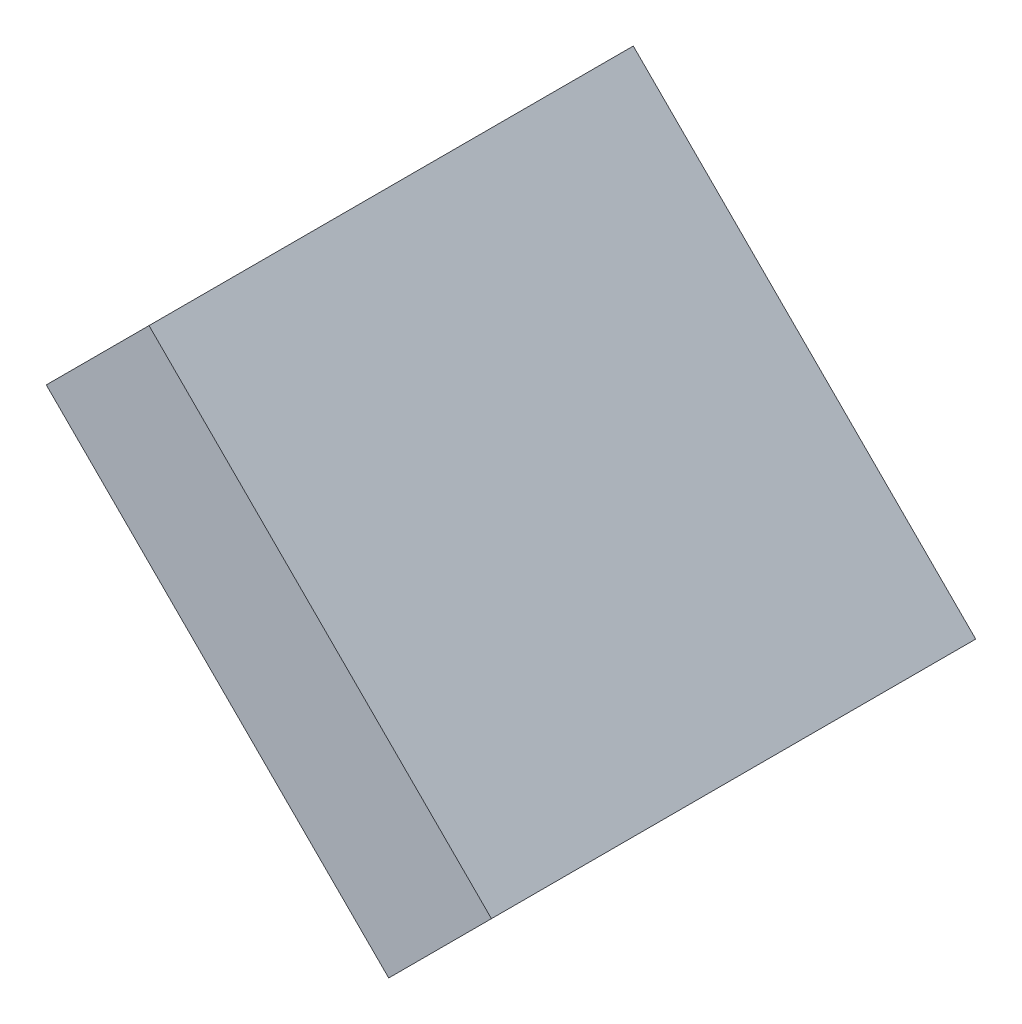
ISO-10303-21;
HEADER;
FILE_DESCRIPTION(('STEP AP214'),'2;1');
FILE_NAME('part.step','',(''),(''),'','','');
FILE_SCHEMA(('AUTOMOTIVE_DESIGN { 1 0 10303 214 1 1 1 1 }'));
ENDSEC;
DATA;
#1=APPLICATION_CONTEXT('core data for automotive mechanical design processes');
#2=APPLICATION_PROTOCOL_DEFINITION('international standard','automotive_design',2000,#1);
#3=PRODUCT_CONTEXT('',#1,'mechanical');
#4=PRODUCT('Part','Part','',(#3));
#5=PRODUCT_RELATED_PRODUCT_CATEGORY('part','',(#4));
#6=PRODUCT_DEFINITION_FORMATION('','',#4);
#7=PRODUCT_DEFINITION_CONTEXT('part definition',#1,'design');
#8=PRODUCT_DEFINITION('design','',#6,#7);
#9=PRODUCT_DEFINITION_SHAPE('','',#8);
#10=(LENGTH_UNIT() NAMED_UNIT(*) SI_UNIT(.MILLI.,.METRE.));
#11=(NAMED_UNIT(*) PLANE_ANGLE_UNIT() SI_UNIT($,.RADIAN.));
#12=(NAMED_UNIT(*) SI_UNIT($,.STERADIAN.) SOLID_ANGLE_UNIT());
#13=UNCERTAINTY_MEASURE_WITH_UNIT(LENGTH_MEASURE(1.E-05),#10,'distance_accuracy_value','');
#14=(GEOMETRIC_REPRESENTATION_CONTEXT(3) GLOBAL_UNCERTAINTY_ASSIGNED_CONTEXT((#13)) GLOBAL_UNIT_ASSIGNED_CONTEXT((#10,
#11,#12)) REPRESENTATION_CONTEXT('',''));
#15=CARTESIAN_POINT('',(0.,0.,0.));
#16=DIRECTION('',(0.,0.,1.));
#17=DIRECTION('',(1.,0.,0.));
#18=AXIS2_PLACEMENT_3D('',#15,#16,#17);
#19=CARTESIAN_POINT('',(101.10612702975,24.563713600431,0.));
#20=DIRECTION('',(-0.707106781186548,-0.707106781186548,0.));
#21=DIRECTION('',(-0.707106781186548,0.707106781186548,0.));
#22=AXIS2_PLACEMENT_3D('',#19,#20,#21);
#23=PLANE('',#22);
#24=DIRECTION('',(0.,0.,1.));
#25=VECTOR('',#24,1.);
#26=CARTESIAN_POINT('',(101.10612702975,24.563713600431,0.));
#27=LINE('',#26,#25);
#28=CARTESIAN_POINT('',(101.10612702975,24.563713600431,0.45));
#29=VERTEX_POINT('',#28);
#30=CARTESIAN_POINT('',(101.10612702975,24.563713600431,0.5));
#31=VERTEX_POINT('',#30);
#32=EDGE_CURVE('E154',#29,#31,#27,.T.);
#33=ORIENTED_EDGE('',*,*,#32,.F.);
#34=DIRECTION('',(-0.707106781186548,0.707106781186548,0.));
#35=VECTOR('',#34,1.);
#36=CARTESIAN_POINT('',(101.10612702975,24.563713600431,0.45));
#37=LINE('',#36,#35);
#38=CARTESIAN_POINT('',(101.45968042035,24.210160209837,0.45));
#39=VERTEX_POINT('',#38);
#40=EDGE_CURVE('E11',#39,#29,#37,.T.);
#41=ORIENTED_EDGE('',*,*,#40,.F.);
#42=DIRECTION('',(0.,0.,1.));
#43=VECTOR('',#42,1.);
#44=CARTESIAN_POINT('',(101.45968042035,24.210160209837,0.));
#45=LINE('',#44,#43);
#46=CARTESIAN_POINT('',(101.45968042035,24.210160209837,0.5));
#47=VERTEX_POINT('',#46);
#48=EDGE_CURVE('E165',#39,#47,#45,.T.);
#49=ORIENTED_EDGE('',*,*,#48,.T.);
#50=DIRECTION('',(0.707106781186548,-0.707106781186548,0.));
#51=VECTOR('',#50,1.);
#52=CARTESIAN_POINT('',(101.10612702975,24.563713600431,0.5));
#53=LINE('',#52,#51);
#54=EDGE_CURVE('E70',#31,#47,#53,.T.);
#55=ORIENTED_EDGE('',*,*,#54,.F.);
#56=EDGE_LOOP('',(#33,#41,#49,#55));
#57=FACE_BOUND('',#56,.T.);
#58=ADVANCED_FACE('F16',(#57),#23,.T.);
#59=CARTESIAN_POINT('',(101.17683770787,24.634424278549,0.45));
#60=DIRECTION('',(0.,0.,1.));
#61=DIRECTION('',(1.,0.,0.));
#62=AXIS2_PLACEMENT_3D('',#59,#60,#61);
#63=PLANE('',#62);
#64=ORIENTED_EDGE('',*,*,#40,.T.);
#65=DIRECTION('',(-0.707106781186548,-0.707106781186548,0.));
#66=VECTOR('',#65,1.);
#67=CARTESIAN_POINT('',(101.17683770787,24.634424278549,0.45));
#68=LINE('',#67,#66);
#69=CARTESIAN_POINT('',(101.17683770787,24.634424278549,0.45));
#70=VERTEX_POINT('',#69);
#71=EDGE_CURVE('E152',#70,#29,#68,.T.);
#72=ORIENTED_EDGE('',*,*,#71,.F.);
#73=DIRECTION('',(0.707106781186548,-0.707106781186548,0.));
#74=VECTOR('',#73,1.);
#75=CARTESIAN_POINT('',(101.17683770787,24.634424278549,0.45));
#76=LINE('',#75,#74);
#77=CARTESIAN_POINT('',(101.53039109847,24.280870887956,0.45));
#78=VERTEX_POINT('',#77);
#79=EDGE_CURVE('E26',#70,#78,#76,.T.);
#80=ORIENTED_EDGE('',*,*,#79,.T.);
#81=DIRECTION('',(-0.707106781186548,-0.707106781186548,0.));
#82=VECTOR('',#81,1.);
#83=CARTESIAN_POINT('',(101.53039109847,24.280870887956,0.45));
#84=LINE('',#83,#82);
#85=EDGE_CURVE('E188',#78,#39,#84,.T.);
#86=ORIENTED_EDGE('',*,*,#85,.T.);
#87=EDGE_LOOP('',(#64,#72,#80,#86));
#88=FACE_BOUND('',#87,.T.);
#89=ADVANCED_FACE('F189',(#88),#63,.F.);
#90=CARTESIAN_POINT('',(101.17683770787,24.634424278549,0.05));
#91=DIRECTION('',(-0.707106781186548,-0.707106781186548,0.));
#92=DIRECTION('',(-0.707106781186548,0.707106781186548,0.));
#93=AXIS2_PLACEMENT_3D('',#90,#91,#92);
#94=PLANE('',#93);
#95=DIRECTION('',(0.,0.,1.));
#96=VECTOR('',#95,1.);
#97=CARTESIAN_POINT('',(101.17683770787,24.634424278549,0.05));
#98=LINE('',#97,#96);
#99=CARTESIAN_POINT('',(101.17683770787,24.634424278549,0.05));
#100=VERTEX_POINT('',#99);
#101=EDGE_CURVE('E148',#100,#70,#98,.T.);
#102=ORIENTED_EDGE('',*,*,#101,.F.);
#103=DIRECTION('',(0.707106781186548,-0.707106781186548,0.));
#104=VECTOR('',#103,1.);
#105=CARTESIAN_POINT('',(101.17683770787,24.634424278549,0.05));
#106=LINE('',#105,#104);
#107=CARTESIAN_POINT('',(101.53039109847,24.280870887956,0.05));
#108=VERTEX_POINT('',#107);
#109=EDGE_CURVE('E40',#100,#108,#106,.T.);
#110=ORIENTED_EDGE('',*,*,#109,.T.);
#111=DIRECTION('',(0.,0.,1.));
#112=VECTOR('',#111,1.);
#113=CARTESIAN_POINT('',(101.53039109847,24.280870887956,0.05));
#114=LINE('',#113,#112);
#115=EDGE_CURVE('E192',#108,#78,#114,.T.);
#116=ORIENTED_EDGE('',*,*,#115,.T.);
#117=ORIENTED_EDGE('',*,*,#79,.F.);
#118=EDGE_LOOP('',(#102,#110,#116,#117));
#119=FACE_BOUND('',#118,.T.);
#120=ADVANCED_FACE('F314',(#119),#94,.T.);
#121=CARTESIAN_POINT('',(101.17683770787,24.634424278549,0.05));
#122=DIRECTION('',(0.,0.,1.));
#123=DIRECTION('',(1.,0.,0.));
#124=AXIS2_PLACEMENT_3D('',#121,#122,#123);
#125=PLANE('',#124);
#126=DIRECTION('',(-0.707106781186548,-0.707106781186548,0.));
#127=VECTOR('',#126,1.);
#128=CARTESIAN_POINT('',(101.53039109847,24.280870887956,0.05));
#129=LINE('',#128,#127);
#130=CARTESIAN_POINT('',(101.45968042035,24.210160209837,0.05));
#131=VERTEX_POINT('',#130);
#132=EDGE_CURVE('E19',#108,#131,#129,.T.);
#133=ORIENTED_EDGE('',*,*,#132,.F.);
#134=ORIENTED_EDGE('',*,*,#109,.F.);
#135=DIRECTION('',(-0.707106781186548,-0.707106781186548,0.));
#136=VECTOR('',#135,1.);
#137=CARTESIAN_POINT('',(101.17683770787,24.634424278549,0.05));
#138=LINE('',#137,#136);
#139=CARTESIAN_POINT('',(101.10612702975,24.563713600431,0.05));
#140=VERTEX_POINT('',#139);
#141=EDGE_CURVE('E153',#100,#140,#138,.T.);
#142=ORIENTED_EDGE('',*,*,#141,.T.);
#143=DIRECTION('',(-0.707106781186548,0.707106781186548,0.));
#144=VECTOR('',#143,1.);
#145=CARTESIAN_POINT('',(101.10612702975,24.563713600431,0.05));
#146=LINE('',#145,#144);
#147=EDGE_CURVE('E143',#131,#140,#146,.T.);
#148=ORIENTED_EDGE('',*,*,#147,.F.);
#149=EDGE_LOOP('',(#133,#134,#142,#148));
#150=FACE_BOUND('',#149,.T.);
#151=ADVANCED_FACE('F318',(#150),#125,.T.);
#152=CARTESIAN_POINT('',(101.10612702975,24.563713600431,0.));
#153=DIRECTION('',(-0.707106781186548,-0.707106781186548,0.));
#154=DIRECTION('',(-0.707106781186548,0.707106781186548,0.));
#155=AXIS2_PLACEMENT_3D('',#152,#153,#154);
#156=PLANE('',#155);
#157=DIRECTION('',(0.,0.,1.));
#158=VECTOR('',#157,1.);
#159=CARTESIAN_POINT('',(101.10612702975,24.563713600431,0.));
#160=LINE('',#159,#158);
#161=CARTESIAN_POINT('',(101.10612702975,24.563713600431,0.));
#162=VERTEX_POINT('',#161);
#163=EDGE_CURVE('E141',#162,#140,#160,.T.);
#164=ORIENTED_EDGE('',*,*,#163,.F.);
#165=DIRECTION('',(0.707106781186548,-0.707106781186548,0.));
#166=VECTOR('',#165,1.);
#167=CARTESIAN_POINT('',(101.10612702975,24.563713600431,0.));
#168=LINE('',#167,#166);
#169=CARTESIAN_POINT('',(101.45968042035,24.210160209837,0.));
#170=VERTEX_POINT('',#169);
#171=EDGE_CURVE('E147',#162,#170,#168,.T.);
#172=ORIENTED_EDGE('',*,*,#171,.T.);
#173=DIRECTION('',(0.,0.,1.));
#174=VECTOR('',#173,1.);
#175=CARTESIAN_POINT('',(101.45968042035,24.210160209837,0.));
#176=LINE('',#175,#174);
#177=EDGE_CURVE('E119',#170,#131,#176,.T.);
#178=ORIENTED_EDGE('',*,*,#177,.T.);
#179=ORIENTED_EDGE('',*,*,#147,.T.);
#180=EDGE_LOOP('',(#164,#172,#178,#179));
#181=FACE_BOUND('',#180,.T.);
#182=ADVANCED_FACE('F326',(#181),#156,.T.);
#183=CARTESIAN_POINT('',(101.21219304693,24.669779617609,0.));
#184=DIRECTION('',(0.,0.,1.));
#185=DIRECTION('',(1.,0.,0.));
#186=AXIS2_PLACEMENT_3D('',#183,#184,#185);
#187=PLANE('',#186);
#188=DIRECTION('',(-0.707106781186548,-0.707106781186548,0.));
#189=VECTOR('',#188,1.);
#190=CARTESIAN_POINT('',(101.56574643753,24.316226227015,0.));
#191=LINE('',#190,#189);
#192=CARTESIAN_POINT('',(101.56574643753,24.316226227015,0.));
#193=VERTEX_POINT('',#192);
#194=EDGE_CURVE('E105',#193,#170,#191,.T.);
#195=ORIENTED_EDGE('',*,*,#194,.T.);
#196=ORIENTED_EDGE('',*,*,#171,.F.);
#197=DIRECTION('',(-0.707106781186548,-0.707106781186548,0.));
#198=VECTOR('',#197,1.);
#199=CARTESIAN_POINT('',(101.21219304693,24.669779617609,0.));
#200=LINE('',#199,#198);
#201=CARTESIAN_POINT('',(101.21219304693,24.669779617609,0.));
#202=VERTEX_POINT('',#201);
#203=EDGE_CURVE('E162',#202,#162,#200,.T.);
#204=ORIENTED_EDGE('',*,*,#203,.F.);
#205=DIRECTION('',(0.707106781186548,-0.707106781186548,0.));
#206=VECTOR('',#205,1.);
#207=CARTESIAN_POINT('',(101.21219304693,24.669779617609,0.));
#208=LINE('',#207,#206);
#209=EDGE_CURVE('E127',#202,#193,#208,.T.);
#210=ORIENTED_EDGE('',*,*,#209,.T.);
#211=EDGE_LOOP('',(#195,#196,#204,#210));
#212=FACE_BOUND('',#211,.T.);
#213=ADVANCED_FACE('F181',(#212),#187,.F.);
#214=CARTESIAN_POINT('',(101.56574643753,24.316226227015,0.));
#215=DIRECTION('',(0.707106781186548,-0.707106781186548,0.));
#216=DIRECTION('',(0.,0.,-1.));
#217=AXIS2_PLACEMENT_3D('',#214,#215,#216);
#218=PLANE('',#217);
#219=ORIENTED_EDGE('',*,*,#177,.F.);
#220=ORIENTED_EDGE('',*,*,#194,.F.);
#221=DIRECTION('',(0.,0.,1.));
#222=VECTOR('',#221,1.);
#223=CARTESIAN_POINT('',(101.56574643753,24.316226227015,0.));
#224=LINE('',#223,#222);
#225=CARTESIAN_POINT('',(101.56574643753,24.316226227015,0.5));
#226=VERTEX_POINT('',#225);
#227=EDGE_CURVE('E122',#193,#226,#224,.T.);
#228=ORIENTED_EDGE('',*,*,#227,.T.);
#229=DIRECTION('',(-0.707106781186548,-0.707106781186548,0.));
#230=VECTOR('',#229,1.);
#231=CARTESIAN_POINT('',(101.56574643753,24.316226227015,0.5));
#232=LINE('',#231,#230);
#233=EDGE_CURVE('E113',#226,#47,#232,.T.);
#234=ORIENTED_EDGE('',*,*,#233,.T.);
#235=ORIENTED_EDGE('',*,*,#48,.F.);
#236=ORIENTED_EDGE('',*,*,#85,.F.);
#237=ORIENTED_EDGE('',*,*,#115,.F.);
#238=ORIENTED_EDGE('',*,*,#132,.T.);
#239=EDGE_LOOP('',(#219,#220,#228,#234,#235,#236,#237,#238));
#240=FACE_BOUND('',#239,.T.);
#241=ADVANCED_FACE('F123',(#240),#218,.T.);
#242=CARTESIAN_POINT('',(101.21219304693,24.669779617609,0.5));
#243=DIRECTION('',(0.,0.,1.));
#244=DIRECTION('',(1.,0.,0.));
#245=AXIS2_PLACEMENT_3D('',#242,#243,#244);
#246=PLANE('',#245);
#247=DIRECTION('',(0.707106781186548,-0.707106781186548,0.));
#248=VECTOR('',#247,1.);
#249=CARTESIAN_POINT('',(101.21219304693,24.669779617609,0.5));
#250=LINE('',#249,#248);
#251=CARTESIAN_POINT('',(101.21219304693,24.669779617609,0.5));
#252=VERTEX_POINT('',#251);
#253=EDGE_CURVE('E116',#252,#226,#250,.T.);
#254=ORIENTED_EDGE('',*,*,#253,.F.);
#255=DIRECTION('',(-0.707106781186548,-0.707106781186548,0.));
#256=VECTOR('',#255,1.);
#257=CARTESIAN_POINT('',(101.21219304693,24.669779617609,0.5));
#258=LINE('',#257,#256);
#259=EDGE_CURVE('E158',#252,#31,#258,.T.);
#260=ORIENTED_EDGE('',*,*,#259,.T.);
#261=ORIENTED_EDGE('',*,*,#54,.T.);
#262=ORIENTED_EDGE('',*,*,#233,.F.);
#263=EDGE_LOOP('',(#254,#260,#261,#262));
#264=FACE_BOUND('',#263,.T.);
#265=ADVANCED_FACE('F114',(#264),#246,.T.);
#266=CARTESIAN_POINT('',(101.21219304693,24.669779617609,0.));
#267=DIRECTION('',(0.707106781186548,-0.707106781186548,0.));
#268=DIRECTION('',(0.,0.,-1.));
#269=AXIS2_PLACEMENT_3D('',#266,#267,#268);
#270=PLANE('',#269);
#271=ORIENTED_EDGE('',*,*,#141,.F.);
#272=ORIENTED_EDGE('',*,*,#101,.T.);
#273=ORIENTED_EDGE('',*,*,#71,.T.);
#274=ORIENTED_EDGE('',*,*,#32,.T.);
#275=ORIENTED_EDGE('',*,*,#259,.F.);
#276=DIRECTION('',(0.,0.,1.));
#277=VECTOR('',#276,1.);
#278=CARTESIAN_POINT('',(101.21219304693,24.669779617609,0.));
#279=LINE('',#278,#277);
#280=EDGE_CURVE('E132',#202,#252,#279,.T.);
#281=ORIENTED_EDGE('',*,*,#280,.F.);
#282=ORIENTED_EDGE('',*,*,#203,.T.);
#283=ORIENTED_EDGE('',*,*,#163,.T.);
#284=EDGE_LOOP('',(#271,#272,#273,#274,#275,#281,#282,#283));
#285=FACE_BOUND('',#284,.T.);
#286=ADVANCED_FACE('F185',(#285),#270,.F.);
#287=CARTESIAN_POINT('',(101.21219304693,24.669779617609,0.));
#288=DIRECTION('',(-0.707106781186548,-0.707106781186548,0.));
#289=DIRECTION('',(-0.707106781186548,0.707106781186548,0.));
#290=AXIS2_PLACEMENT_3D('',#287,#288,#289);
#291=PLANE('',#290);
#292=ORIENTED_EDGE('',*,*,#253,.T.);
#293=ORIENTED_EDGE('',*,*,#227,.F.);
#294=ORIENTED_EDGE('',*,*,#209,.F.);
#295=ORIENTED_EDGE('',*,*,#280,.T.);
#296=EDGE_LOOP('',(#292,#293,#294,#295));
#297=FACE_BOUND('',#296,.T.);
#298=ADVANCED_FACE('F130',(#297),#291,.F.);
#299=CLOSED_SHELL('',(#58,#89,#120,#151,#182,#213,#241,#265,#286,#298));
#300=MANIFOLD_SOLID_BREP('B1',#299);
#301=ADVANCED_BREP_SHAPE_REPRESENTATION('',(#18,#300),#14);
#302=SHAPE_DEFINITION_REPRESENTATION(#9,#301);
ENDSEC;
END-ISO-10303-21;
